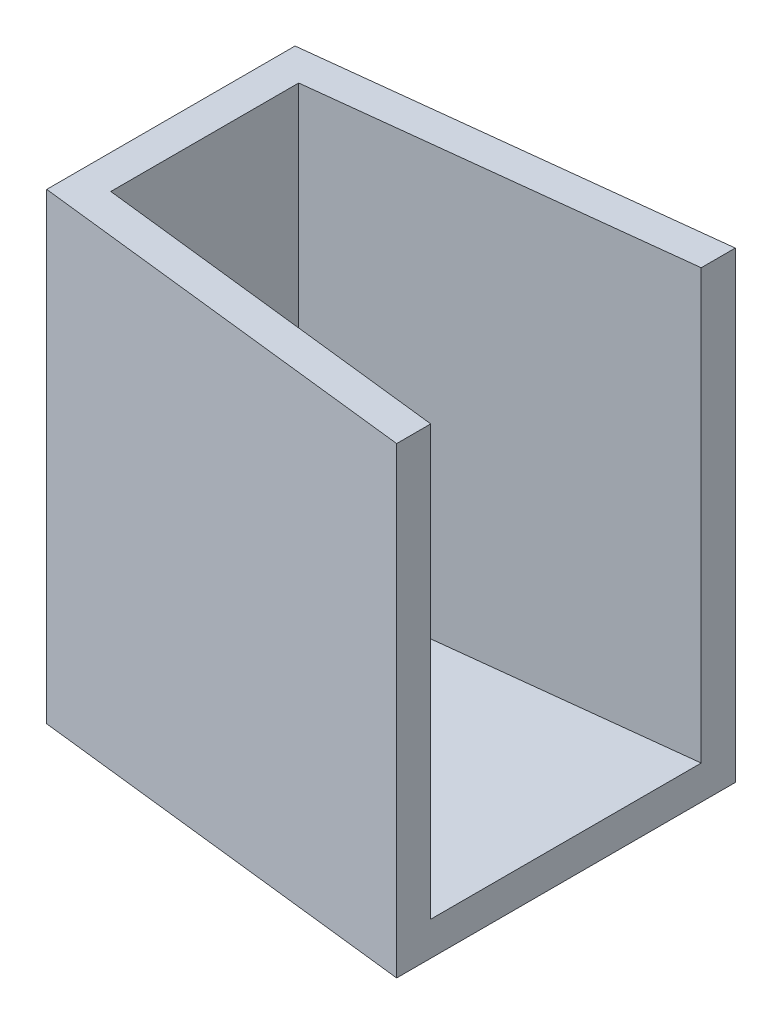
ISO-10303-21;
HEADER;
FILE_DESCRIPTION(('STEP AP214'),'2;1');
FILE_NAME('part.step','',(''),(''),'','','');
FILE_SCHEMA(('AUTOMOTIVE_DESIGN { 1 0 10303 214 1 1 1 1 }'));
ENDSEC;
DATA;
#1=APPLICATION_CONTEXT('core data for automotive mechanical design processes');
#2=APPLICATION_PROTOCOL_DEFINITION('international standard','automotive_design',2000,#1);
#3=PRODUCT_CONTEXT('',#1,'mechanical');
#4=PRODUCT('Part','Part','',(#3));
#5=PRODUCT_RELATED_PRODUCT_CATEGORY('part','',(#4));
#6=PRODUCT_DEFINITION_FORMATION('','',#4);
#7=PRODUCT_DEFINITION_CONTEXT('part definition',#1,'design');
#8=PRODUCT_DEFINITION('design','',#6,#7);
#9=PRODUCT_DEFINITION_SHAPE('','',#8);
#10=(LENGTH_UNIT() NAMED_UNIT(*) SI_UNIT(.MILLI.,.METRE.));
#11=(NAMED_UNIT(*) PLANE_ANGLE_UNIT() SI_UNIT($,.RADIAN.));
#12=(NAMED_UNIT(*) SI_UNIT($,.STERADIAN.) SOLID_ANGLE_UNIT());
#13=UNCERTAINTY_MEASURE_WITH_UNIT(LENGTH_MEASURE(1.E-05),#10,'distance_accuracy_value','');
#14=(GEOMETRIC_REPRESENTATION_CONTEXT(3) GLOBAL_UNCERTAINTY_ASSIGNED_CONTEXT((#13)) GLOBAL_UNIT_ASSIGNED_CONTEXT((#10,
#11,#12)) REPRESENTATION_CONTEXT('',''));
#15=CARTESIAN_POINT('',(0.,0.,0.));
#16=DIRECTION('',(0.,0.,1.));
#17=DIRECTION('',(1.,0.,0.));
#18=AXIS2_PLACEMENT_3D('',#15,#16,#17);
#19=CARTESIAN_POINT('',(0.,3.,0.));
#20=DIRECTION('',(0.,1.,0.));
#21=DIRECTION('',(0.,0.,1.));
#22=AXIS2_PLACEMENT_3D('',#19,#20,#21);
#23=PLANE('',#22);
#24=DIRECTION('',(0.,0.,-1.));
#25=VECTOR('',#24,1.);
#26=CARTESIAN_POINT('',(-32.,3.,0.));
#27=LINE('',#26,#25);
#28=CARTESIAN_POINT('',(-32.,3.,8.3233288650614));
#29=VERTEX_POINT('',#28);
#30=CARTESIAN_POINT('',(-32.,3.,-8.32332886506139));
#31=VERTEX_POINT('',#30);
#32=EDGE_CURVE('E58',#29,#31,#27,.T.);
#33=ORIENTED_EDGE('',*,*,#32,.F.);
#34=DIRECTION('',(0.993532672656404,0.,0.113546591160732));
#35=VECTOR('',#34,1.);
#36=CARTESIAN_POINT('',(-1.35154394932199,3.,11.8260095565675));
#37=LINE('',#36,#35);
#38=CARTESIAN_POINT('',(0.,3.,11.9804717222042));
#39=VERTEX_POINT('',#38);
#40=EDGE_CURVE('E112',#29,#39,#37,.T.);
#41=ORIENTED_EDGE('',*,*,#40,.T.);
#42=DIRECTION('',(0.,0.,-1.));
#43=VECTOR('',#42,1.);
#44=CARTESIAN_POINT('',(0.,3.,0.));
#45=LINE('',#44,#43);
#46=CARTESIAN_POINT('',(0.,3.,-11.9804717222043));
#47=VERTEX_POINT('',#46);
#48=EDGE_CURVE('E63',#39,#47,#45,.T.);
#49=ORIENTED_EDGE('',*,*,#48,.T.);
#50=DIRECTION('',(0.993532672656404,0.,-0.113546591160732));
#51=VECTOR('',#50,1.);
#52=CARTESIAN_POINT('',(-1.351543949322,3.,-11.8260095565675));
#53=LINE('',#52,#51);
#54=EDGE_CURVE('E130',#31,#47,#53,.T.);
#55=ORIENTED_EDGE('',*,*,#54,.F.);
#56=EDGE_LOOP('',(#33,#41,#49,#55));
#57=FACE_BOUND('',#56,.T.);
#58=ADVANCED_FACE('F43',(#57),#23,.T.);
#59=CARTESIAN_POINT('',(-1.69218372280419,3.,-14.8066075745367));
#60=DIRECTION('',(-0.113546591160732,0.,-0.993532672656404));
#61=DIRECTION('',(-0.993532672656404,0.,0.113546591160732));
#62=AXIS2_PLACEMENT_3D('',#59,#60,#61);
#63=PLANE('',#62);
#64=DIRECTION('',(0.993532672656404,0.,-0.113546591160732));
#65=VECTOR('',#64,1.);
#66=CARTESIAN_POINT('',(-1.69218372280419,0.,-14.8066075745367));
#67=LINE('',#66,#65);
#68=CARTESIAN_POINT('',(-35.,0.,-11.));
#69=VERTEX_POINT('',#68);
#70=CARTESIAN_POINT('',(0.,0.,-15.));
#71=VERTEX_POINT('',#70);
#72=EDGE_CURVE('E114',#69,#71,#67,.T.);
#73=ORIENTED_EDGE('',*,*,#72,.F.);
#74=DIRECTION('',(0.,-1.,0.));
#75=VECTOR('',#74,1.);
#76=CARTESIAN_POINT('',(-35.,3.,-11.));
#77=LINE('',#76,#75);
#78=CARTESIAN_POINT('',(-35.,41.,-11.));
#79=VERTEX_POINT('',#78);
#80=EDGE_CURVE('E11',#79,#69,#77,.T.);
#81=ORIENTED_EDGE('',*,*,#80,.F.);
#82=DIRECTION('',(-0.993532672656404,0.,0.113546591160732));
#83=VECTOR('',#82,1.);
#84=CARTESIAN_POINT('',(-1.69218372280419,41.,-14.8066075745367));
#85=LINE('',#84,#83);
#86=CARTESIAN_POINT('',(0.,41.,-15.));
#87=VERTEX_POINT('',#86);
#88=EDGE_CURVE('E138',#87,#79,#85,.T.);
#89=ORIENTED_EDGE('',*,*,#88,.F.);
#90=DIRECTION('',(0.,-1.,0.));
#91=VECTOR('',#90,1.);
#92=CARTESIAN_POINT('',(0.,3.,-15.));
#93=LINE('',#92,#91);
#94=EDGE_CURVE('E155',#87,#71,#93,.T.);
#95=ORIENTED_EDGE('',*,*,#94,.T.);
#96=EDGE_LOOP('',(#73,#81,#89,#95));
#97=FACE_BOUND('',#96,.T.);
#98=ADVANCED_FACE('F45',(#97),#63,.T.);
#99=CARTESIAN_POINT('',(-35.,3.,0.));
#100=DIRECTION('',(-1.,0.,0.));
#101=DIRECTION('',(0.,0.,1.));
#102=AXIS2_PLACEMENT_3D('',#99,#100,#101);
#103=PLANE('',#102);
#104=DIRECTION('',(0.,0.,-1.));
#105=VECTOR('',#104,1.);
#106=CARTESIAN_POINT('',(-35.,0.,0.));
#107=LINE('',#106,#105);
#108=CARTESIAN_POINT('',(-35.,0.,11.));
#109=VERTEX_POINT('',#108);
#110=EDGE_CURVE('E159',#109,#69,#107,.T.);
#111=ORIENTED_EDGE('',*,*,#110,.F.);
#112=DIRECTION('',(0.,-1.,0.));
#113=VECTOR('',#112,1.);
#114=CARTESIAN_POINT('',(-35.,3.,11.));
#115=LINE('',#114,#113);
#116=CARTESIAN_POINT('',(-35.,41.,11.));
#117=VERTEX_POINT('',#116);
#118=EDGE_CURVE('E51',#117,#109,#115,.T.);
#119=ORIENTED_EDGE('',*,*,#118,.F.);
#120=DIRECTION('',(0.,0.,1.));
#121=VECTOR('',#120,1.);
#122=CARTESIAN_POINT('',(-35.,41.,0.));
#123=LINE('',#122,#121);
#124=EDGE_CURVE('E141',#79,#117,#123,.T.);
#125=ORIENTED_EDGE('',*,*,#124,.F.);
#126=ORIENTED_EDGE('',*,*,#80,.T.);
#127=EDGE_LOOP('',(#111,#119,#125,#126));
#128=FACE_BOUND('',#127,.T.);
#129=ADVANCED_FACE('F179',(#128),#103,.T.);
#130=CARTESIAN_POINT('',(-1.69218372280419,3.,14.8066075745367));
#131=DIRECTION('',(0.113546591160732,0.,-0.993532672656404));
#132=DIRECTION('',(-0.993532672656404,0.,-0.113546591160732));
#133=AXIS2_PLACEMENT_3D('',#130,#131,#132);
#134=PLANE('',#133);
#135=DIRECTION('',(0.993532672656404,0.,0.113546591160732));
#136=VECTOR('',#135,1.);
#137=CARTESIAN_POINT('',(-1.69218372280419,0.,14.8066075745367));
#138=LINE('',#137,#136);
#139=CARTESIAN_POINT('',(0.,0.,15.));
#140=VERTEX_POINT('',#139);
#141=EDGE_CURVE('E162',#109,#140,#138,.T.);
#142=ORIENTED_EDGE('',*,*,#141,.T.);
#143=DIRECTION('',(0.,-1.,0.));
#144=VECTOR('',#143,1.);
#145=CARTESIAN_POINT('',(0.,3.,15.));
#146=LINE('',#145,#144);
#147=CARTESIAN_POINT('',(0.,41.,15.));
#148=VERTEX_POINT('',#147);
#149=EDGE_CURVE('E167',#148,#140,#146,.T.);
#150=ORIENTED_EDGE('',*,*,#149,.F.);
#151=DIRECTION('',(0.993532672656404,0.,0.113546591160732));
#152=VECTOR('',#151,1.);
#153=CARTESIAN_POINT('',(-1.69218372280419,41.,14.8066075745367));
#154=LINE('',#153,#152);
#155=EDGE_CURVE('E144',#117,#148,#154,.T.);
#156=ORIENTED_EDGE('',*,*,#155,.F.);
#157=ORIENTED_EDGE('',*,*,#118,.T.);
#158=EDGE_LOOP('',(#142,#150,#156,#157));
#159=FACE_BOUND('',#158,.T.);
#160=ADVANCED_FACE('F172',(#159),#134,.F.);
#161=CARTESIAN_POINT('',(0.,3.,0.));
#162=DIRECTION('',(-1.,0.,0.));
#163=DIRECTION('',(0.,0.,1.));
#164=AXIS2_PLACEMENT_3D('',#161,#162,#163);
#165=PLANE('',#164);
#166=DIRECTION('',(0.,0.,-1.));
#167=VECTOR('',#166,1.);
#168=CARTESIAN_POINT('',(0.,0.,0.));
#169=LINE('',#168,#167);
#170=EDGE_CURVE('E156',#140,#71,#169,.T.);
#171=ORIENTED_EDGE('',*,*,#170,.T.);
#172=ORIENTED_EDGE('',*,*,#94,.F.);
#173=DIRECTION('',(0.,0.,-1.));
#174=VECTOR('',#173,1.);
#175=CARTESIAN_POINT('',(0.,41.,0.));
#176=LINE('',#175,#174);
#177=CARTESIAN_POINT('',(0.,41.,-11.9804717222043));
#178=VERTEX_POINT('',#177);
#179=EDGE_CURVE('E135',#178,#87,#176,.T.);
#180=ORIENTED_EDGE('',*,*,#179,.F.);
#181=DIRECTION('',(0.,-1.,0.));
#182=VECTOR('',#181,1.);
#183=CARTESIAN_POINT('',(0.,41.,-11.9804717222043));
#184=LINE('',#183,#182);
#185=EDGE_CURVE('E150',#178,#47,#184,.T.);
#186=ORIENTED_EDGE('',*,*,#185,.T.);
#187=ORIENTED_EDGE('',*,*,#48,.F.);
#188=DIRECTION('',(0.,-1.,0.));
#189=VECTOR('',#188,1.);
#190=CARTESIAN_POINT('',(0.,41.,11.9804717222042));
#191=LINE('',#190,#189);
#192=CARTESIAN_POINT('',(0.,41.,11.9804717222042));
#193=VERTEX_POINT('',#192);
#194=EDGE_CURVE('E148',#193,#39,#191,.T.);
#195=ORIENTED_EDGE('',*,*,#194,.F.);
#196=EDGE_CURVE('E128',#148,#193,#176,.T.);
#197=ORIENTED_EDGE('',*,*,#196,.F.);
#198=ORIENTED_EDGE('',*,*,#149,.T.);
#199=EDGE_LOOP('',(#171,#172,#180,#186,#187,#195,#197,#198));
#200=FACE_BOUND('',#199,.T.);
#201=ADVANCED_FACE('F185',(#200),#165,.F.);
#202=CARTESIAN_POINT('',(0.,0.,0.));
#203=DIRECTION('',(0.,1.,0.));
#204=DIRECTION('',(0.,0.,1.));
#205=AXIS2_PLACEMENT_3D('',#202,#203,#204);
#206=PLANE('',#205);
#207=ORIENTED_EDGE('',*,*,#72,.T.);
#208=ORIENTED_EDGE('',*,*,#170,.F.);
#209=ORIENTED_EDGE('',*,*,#141,.F.);
#210=ORIENTED_EDGE('',*,*,#110,.T.);
#211=EDGE_LOOP('',(#207,#208,#209,#210));
#212=FACE_BOUND('',#211,.T.);
#213=ADVANCED_FACE('F178',(#212),#206,.F.);
#214=CARTESIAN_POINT('',(-1.35154394932199,41.,11.8260095565675));
#215=DIRECTION('',(0.113546591160732,0.,-0.993532672656404));
#216=DIRECTION('',(-0.993532672656404,0.,-0.113546591160732));
#217=AXIS2_PLACEMENT_3D('',#214,#215,#216);
#218=PLANE('',#217);
#219=ORIENTED_EDGE('',*,*,#40,.F.);
#220=DIRECTION('',(0.,-1.,0.));
#221=VECTOR('',#220,1.);
#222=CARTESIAN_POINT('',(-32.,41.,8.3233288650614));
#223=LINE('',#222,#221);
#224=CARTESIAN_POINT('',(-32.,41.,8.3233288650614));
#225=VERTEX_POINT('',#224);
#226=EDGE_CURVE('E106',#225,#29,#223,.T.);
#227=ORIENTED_EDGE('',*,*,#226,.F.);
#228=DIRECTION('',(0.993532672656404,0.,0.113546591160732));
#229=VECTOR('',#228,1.);
#230=CARTESIAN_POINT('',(-1.35154394932199,41.,11.8260095565675));
#231=LINE('',#230,#229);
#232=EDGE_CURVE('E111',#225,#193,#231,.T.);
#233=ORIENTED_EDGE('',*,*,#232,.T.);
#234=ORIENTED_EDGE('',*,*,#194,.T.);
#235=EDGE_LOOP('',(#219,#227,#233,#234));
#236=FACE_BOUND('',#235,.T.);
#237=ADVANCED_FACE('F108',(#236),#218,.T.);
#238=CARTESIAN_POINT('',(-32.,41.,0.));
#239=DIRECTION('',(-1.,0.,0.));
#240=DIRECTION('',(0.,0.,1.));
#241=AXIS2_PLACEMENT_3D('',#238,#239,#240);
#242=PLANE('',#241);
#243=ORIENTED_EDGE('',*,*,#32,.T.);
#244=DIRECTION('',(0.,-1.,0.));
#245=VECTOR('',#244,1.);
#246=CARTESIAN_POINT('',(-32.,41.,-8.32332886506139));
#247=LINE('',#246,#245);
#248=CARTESIAN_POINT('',(-32.,41.,-8.32332886506139));
#249=VERTEX_POINT('',#248);
#250=EDGE_CURVE('E115',#249,#31,#247,.T.);
#251=ORIENTED_EDGE('',*,*,#250,.F.);
#252=DIRECTION('',(0.,0.,-1.));
#253=VECTOR('',#252,1.);
#254=CARTESIAN_POINT('',(-32.,41.,0.));
#255=LINE('',#254,#253);
#256=EDGE_CURVE('E118',#225,#249,#255,.T.);
#257=ORIENTED_EDGE('',*,*,#256,.F.);
#258=ORIENTED_EDGE('',*,*,#226,.T.);
#259=EDGE_LOOP('',(#243,#251,#257,#258));
#260=FACE_BOUND('',#259,.T.);
#261=ADVANCED_FACE('F119',(#260),#242,.F.);
#262=CARTESIAN_POINT('',(-1.351543949322,41.,-11.8260095565675));
#263=DIRECTION('',(-0.113546591160732,0.,-0.993532672656404));
#264=DIRECTION('',(-0.993532672656404,0.,0.113546591160732));
#265=AXIS2_PLACEMENT_3D('',#262,#263,#264);
#266=PLANE('',#265);
#267=ORIENTED_EDGE('',*,*,#54,.T.);
#268=ORIENTED_EDGE('',*,*,#185,.F.);
#269=DIRECTION('',(0.993532672656404,0.,-0.113546591160732));
#270=VECTOR('',#269,1.);
#271=CARTESIAN_POINT('',(-1.351543949322,41.,-11.8260095565675));
#272=LINE('',#271,#270);
#273=EDGE_CURVE('E123',#249,#178,#272,.T.);
#274=ORIENTED_EDGE('',*,*,#273,.F.);
#275=ORIENTED_EDGE('',*,*,#250,.T.);
#276=EDGE_LOOP('',(#267,#268,#274,#275));
#277=FACE_BOUND('',#276,.T.);
#278=ADVANCED_FACE('F188',(#277),#266,.F.);
#279=CARTESIAN_POINT('',(0.,41.,0.));
#280=DIRECTION('',(0.,1.,0.));
#281=DIRECTION('',(0.,0.,1.));
#282=AXIS2_PLACEMENT_3D('',#279,#280,#281);
#283=PLANE('',#282);
#284=ORIENTED_EDGE('',*,*,#232,.F.);
#285=ORIENTED_EDGE('',*,*,#256,.T.);
#286=ORIENTED_EDGE('',*,*,#273,.T.);
#287=ORIENTED_EDGE('',*,*,#179,.T.);
#288=ORIENTED_EDGE('',*,*,#88,.T.);
#289=ORIENTED_EDGE('',*,*,#124,.T.);
#290=ORIENTED_EDGE('',*,*,#155,.T.);
#291=ORIENTED_EDGE('',*,*,#196,.T.);
#292=EDGE_LOOP('',(#284,#285,#286,#287,#288,#289,#290,#291));
#293=FACE_BOUND('',#292,.T.);
#294=ADVANCED_FACE('F125',(#293),#283,.T.);
#295=CLOSED_SHELL('',(#58,#98,#129,#160,#201,#213,#237,#261,#278,#294));
#296=MANIFOLD_SOLID_BREP('B2',#295);
#297=ADVANCED_BREP_SHAPE_REPRESENTATION('',(#18,#296),#14);
#298=SHAPE_DEFINITION_REPRESENTATION(#9,#297);
ENDSEC;
END-ISO-10303-21;
